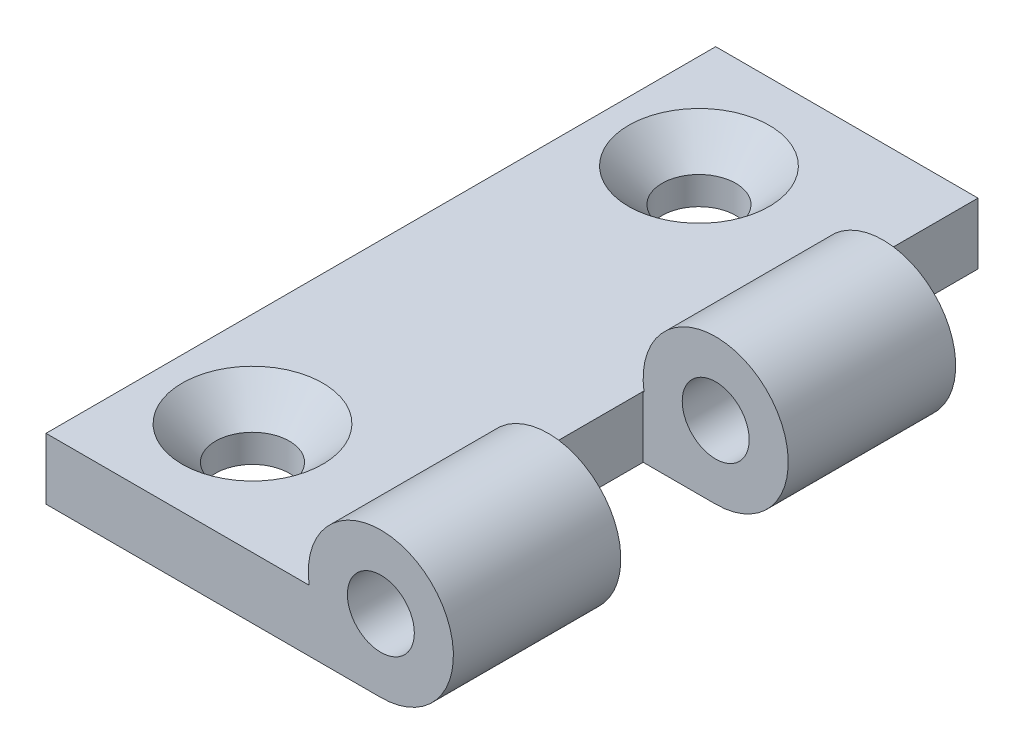
ISO-10303-21;
HEADER;
FILE_DESCRIPTION(('STEP AP214'),'2;1');
FILE_NAME('part.step','',(''),(''),'','','');
FILE_SCHEMA(('AUTOMOTIVE_DESIGN { 1 0 10303 214 1 1 1 1 }'));
ENDSEC;
DATA;
#1=APPLICATION_CONTEXT('core data for automotive mechanical design processes');
#2=APPLICATION_PROTOCOL_DEFINITION('international standard','automotive_design',2000,#1);
#3=PRODUCT_CONTEXT('',#1,'mechanical');
#4=PRODUCT('Part','Part','',(#3));
#5=PRODUCT_RELATED_PRODUCT_CATEGORY('part','',(#4));
#6=PRODUCT_DEFINITION_FORMATION('','',#4);
#7=PRODUCT_DEFINITION_CONTEXT('part definition',#1,'design');
#8=PRODUCT_DEFINITION('design','',#6,#7);
#9=PRODUCT_DEFINITION_SHAPE('','',#8);
#10=(LENGTH_UNIT() NAMED_UNIT(*) SI_UNIT(.MILLI.,.METRE.));
#11=(NAMED_UNIT(*) PLANE_ANGLE_UNIT() SI_UNIT($,.RADIAN.));
#12=(NAMED_UNIT(*) SI_UNIT($,.STERADIAN.) SOLID_ANGLE_UNIT());
#13=UNCERTAINTY_MEASURE_WITH_UNIT(LENGTH_MEASURE(1.E-05),#10,'distance_accuracy_value','');
#14=(GEOMETRIC_REPRESENTATION_CONTEXT(3) GLOBAL_UNCERTAINTY_ASSIGNED_CONTEXT((#13)) GLOBAL_UNIT_ASSIGNED_CONTEXT((#10,
#11,#12)) REPRESENTATION_CONTEXT('',''));
#15=CARTESIAN_POINT('',(0.,0.,0.));
#16=DIRECTION('',(0.,0.,1.));
#17=DIRECTION('',(1.,0.,0.));
#18=AXIS2_PLACEMENT_3D('',#15,#16,#17);
#19=CARTESIAN_POINT('',(0.,-6.5,30.));
#20=DIRECTION('',(0.,-1.,0.));
#21=DIRECTION('',(1.,0.,0.));
#22=AXIS2_PLACEMENT_3D('',#19,#20,#21);
#23=PLANE('',#22);
#24=CARTESIAN_POINT('',(-21.5,-6.5,-20.));
#25=DIRECTION('',(0.,1.,0.));
#26=DIRECTION('',(0.,0.,1.));
#27=AXIS2_PLACEMENT_3D('',#24,#25,#26);
#28=CIRCLE('',#27,3.3);
#29=CARTESIAN_POINT('',(-21.5,-6.5,-16.7));
#30=VERTEX_POINT('',#29);
#31=EDGE_CURVE('E193',#30,#30,#28,.T.);
#32=ORIENTED_EDGE('',*,*,#31,.T.);
#33=EDGE_LOOP('',(#32));
#34=FACE_BOUND('',#33,.T.);
#35=CARTESIAN_POINT('',(-21.5,-6.5,20.));
#36=DIRECTION('',(0.,1.,0.));
#37=DIRECTION('',(0.,0.,1.));
#38=AXIS2_PLACEMENT_3D('',#35,#36,#37);
#39=CIRCLE('',#38,3.3);
#40=CARTESIAN_POINT('',(-21.5,-6.5,23.3));
#41=VERTEX_POINT('',#40);
#42=EDGE_CURVE('E140',#41,#41,#39,.T.);
#43=ORIENTED_EDGE('',*,*,#42,.T.);
#44=EDGE_LOOP('',(#43));
#45=FACE_BOUND('',#44,.T.);
#46=DIRECTION('',(0.,0.,1.));
#47=VECTOR('',#46,1.);
#48=CARTESIAN_POINT('',(-6.5,-6.5,-30.));
#49=LINE('',#48,#47);
#50=CARTESIAN_POINT('',(-6.5,-6.5,-30.));
#51=VERTEX_POINT('',#50);
#52=CARTESIAN_POINT('',(-6.5,-6.5,-15.));
#53=VERTEX_POINT('',#52);
#54=EDGE_CURVE('E111',#51,#53,#49,.T.);
#55=ORIENTED_EDGE('',*,*,#54,.T.);
#56=DIRECTION('',(1.,0.,0.));
#57=VECTOR('',#56,1.);
#58=CARTESIAN_POINT('',(6.5,-6.5,-15.));
#59=LINE('',#58,#57);
#60=CARTESIAN_POINT('',(0.,-6.5,-15.));
#61=VERTEX_POINT('',#60);
#62=EDGE_CURVE('E125',#53,#61,#59,.T.);
#63=ORIENTED_EDGE('',*,*,#62,.T.);
#64=DIRECTION('',(0.,0.,-1.));
#65=VECTOR('',#64,1.);
#66=CARTESIAN_POINT('',(0.,-6.5,30.));
#67=LINE('',#66,#65);
#68=CARTESIAN_POINT('',(0.,-6.5,0.));
#69=VERTEX_POINT('',#68);
#70=EDGE_CURVE('E160',#69,#61,#67,.T.);
#71=ORIENTED_EDGE('',*,*,#70,.F.);
#72=DIRECTION('',(-1.,0.,0.));
#73=VECTOR('',#72,1.);
#74=CARTESIAN_POINT('',(6.5,-6.5,0.));
#75=LINE('',#74,#73);
#76=CARTESIAN_POINT('',(-6.5,-6.5,0.));
#77=VERTEX_POINT('',#76);
#78=EDGE_CURVE('E121',#69,#77,#75,.T.);
#79=ORIENTED_EDGE('',*,*,#78,.T.);
#80=DIRECTION('',(0.,0.,1.));
#81=VECTOR('',#80,1.);
#82=CARTESIAN_POINT('',(-6.5,-6.5,0.));
#83=LINE('',#82,#81);
#84=CARTESIAN_POINT('',(-6.5,-6.5,15.));
#85=VERTEX_POINT('',#84);
#86=EDGE_CURVE('E285',#77,#85,#83,.T.);
#87=ORIENTED_EDGE('',*,*,#86,.T.);
#88=DIRECTION('',(1.,0.,0.));
#89=VECTOR('',#88,1.);
#90=CARTESIAN_POINT('',(6.5,-6.5,15.));
#91=LINE('',#90,#89);
#92=CARTESIAN_POINT('',(0.,-6.5,15.));
#93=VERTEX_POINT('',#92);
#94=EDGE_CURVE('E281',#85,#93,#91,.T.);
#95=ORIENTED_EDGE('',*,*,#94,.T.);
#96=CARTESIAN_POINT('',(0.,-6.5,30.));
#97=VERTEX_POINT('',#96);
#98=EDGE_CURVE('E48',#97,#93,#67,.T.);
#99=ORIENTED_EDGE('',*,*,#98,.F.);
#100=DIRECTION('',(-1.,0.,0.));
#101=VECTOR('',#100,1.);
#102=CARTESIAN_POINT('',(0.,-6.5,30.));
#103=LINE('',#102,#101);
#104=CARTESIAN_POINT('',(-30.,-6.5,30.));
#105=VERTEX_POINT('',#104);
#106=EDGE_CURVE('E149',#97,#105,#103,.T.);
#107=ORIENTED_EDGE('',*,*,#106,.T.);
#108=DIRECTION('',(0.,0.,-1.));
#109=VECTOR('',#108,1.);
#110=CARTESIAN_POINT('',(-30.,-6.5,30.));
#111=LINE('',#110,#109);
#112=CARTESIAN_POINT('',(-30.,-6.5,-30.));
#113=VERTEX_POINT('',#112);
#114=EDGE_CURVE('E135',#105,#113,#111,.T.);
#115=ORIENTED_EDGE('',*,*,#114,.T.);
#116=DIRECTION('',(-1.,0.,0.));
#117=VECTOR('',#116,1.);
#118=CARTESIAN_POINT('',(0.,-6.5,-30.));
#119=LINE('',#118,#117);
#120=EDGE_CURVE('E129',#51,#113,#119,.T.);
#121=ORIENTED_EDGE('',*,*,#120,.F.);
#122=EDGE_LOOP('',(#55,#63,#71,#79,#87,#95,#99,#107,#115,#121));
#123=FACE_BOUND('',#122,.T.);
#124=ADVANCED_FACE('F41',(#34,#45,#123),#23,.T.);
#125=CARTESIAN_POINT('',(0.,0.,30.));
#126=DIRECTION('',(0.,0.,-1.));
#127=DIRECTION('',(-1.,0.,0.));
#128=AXIS2_PLACEMENT_3D('',#125,#126,#127);
#129=CYLINDRICAL_SURFACE('',#128,6.5);
#130=CARTESIAN_POINT('',(0.,0.,15.));
#131=DIRECTION('',(0.,0.,1.));
#132=DIRECTION('',(1.,0.,0.));
#133=AXIS2_PLACEMENT_3D('',#130,#131,#132);
#134=CIRCLE('',#133,6.5);
#135=CARTESIAN_POINT('',(-6.42261628933256,-1.,15.));
#136=VERTEX_POINT('',#135);
#137=EDGE_CURVE('E171',#93,#136,#134,.T.);
#138=ORIENTED_EDGE('',*,*,#137,.T.);
#139=DIRECTION('',(0.,0.,-1.));
#140=VECTOR('',#139,1.);
#141=CARTESIAN_POINT('',(-6.42261628933256,-1.,30.));
#142=LINE('',#141,#140);
#143=CARTESIAN_POINT('',(-6.42261628933256,-1.,30.));
#144=VERTEX_POINT('',#143);
#145=EDGE_CURVE('E152',#144,#136,#142,.T.);
#146=ORIENTED_EDGE('',*,*,#145,.F.);
#147=CARTESIAN_POINT('',(0.,0.,30.));
#148=DIRECTION('',(0.,0.,1.));
#149=DIRECTION('',(1.,0.,0.));
#150=AXIS2_PLACEMENT_3D('',#147,#148,#149);
#151=CIRCLE('',#150,6.5);
#152=EDGE_CURVE('E199',#97,#144,#151,.T.);
#153=ORIENTED_EDGE('',*,*,#152,.F.);
#154=ORIENTED_EDGE('',*,*,#98,.T.);
#155=EDGE_LOOP('',(#138,#146,#153,#154));
#156=FACE_BOUND('',#155,.T.);
#157=ADVANCED_FACE('F233',(#156),#129,.T.);
#158=CARTESIAN_POINT('',(0.,0.,30.));
#159=DIRECTION('',(0.,0.,-1.));
#160=DIRECTION('',(-1.,0.,0.));
#161=AXIS2_PLACEMENT_3D('',#158,#159,#160);
#162=CYLINDRICAL_SURFACE('',#161,3.);
#163=CARTESIAN_POINT('',(0.,0.,15.));
#164=DIRECTION('',(0.,0.,1.));
#165=DIRECTION('',(1.,0.,0.));
#166=AXIS2_PLACEMENT_3D('',#163,#164,#165);
#167=CIRCLE('',#166,3.);
#168=CARTESIAN_POINT('',(3.,0.,15.));
#169=VERTEX_POINT('',#168);
#170=EDGE_CURVE('E164',#169,#169,#167,.T.);
#171=ORIENTED_EDGE('',*,*,#170,.F.);
#172=EDGE_LOOP('',(#171));
#173=FACE_BOUND('',#172,.T.);
#174=CARTESIAN_POINT('',(0.,0.,30.));
#175=DIRECTION('',(0.,0.,1.));
#176=DIRECTION('',(1.,0.,0.));
#177=AXIS2_PLACEMENT_3D('',#174,#175,#176);
#178=CIRCLE('',#177,3.);
#179=CARTESIAN_POINT('',(3.,0.,30.));
#180=VERTEX_POINT('',#179);
#181=EDGE_CURVE('E144',#180,#180,#178,.T.);
#182=ORIENTED_EDGE('',*,*,#181,.T.);
#183=EDGE_LOOP('',(#182));
#184=FACE_BOUND('',#183,.T.);
#185=ADVANCED_FACE('F211',(#173,#184),#162,.F.);
#186=CARTESIAN_POINT('',(0.,0.,-30.));
#187=DIRECTION('',(0.,0.,1.));
#188=DIRECTION('',(1.,0.,0.));
#189=AXIS2_PLACEMENT_3D('',#186,#187,#188);
#190=PLANE('',#189);
#191=DIRECTION('',(0.,1.,0.));
#192=VECTOR('',#191,1.);
#193=CARTESIAN_POINT('',(-6.5,-6.5,-30.));
#194=LINE('',#193,#192);
#195=CARTESIAN_POINT('',(-6.5,-1.,-30.));
#196=VERTEX_POINT('',#195);
#197=EDGE_CURVE('E64',#51,#196,#194,.T.);
#198=ORIENTED_EDGE('',*,*,#197,.F.);
#199=ORIENTED_EDGE('',*,*,#120,.T.);
#200=DIRECTION('',(0.,1.,0.));
#201=VECTOR('',#200,1.);
#202=CARTESIAN_POINT('',(-30.,0.,-30.));
#203=LINE('',#202,#201);
#204=CARTESIAN_POINT('',(-30.,-1.,-30.));
#205=VERTEX_POINT('',#204);
#206=EDGE_CURVE('E137',#113,#205,#203,.T.);
#207=ORIENTED_EDGE('',*,*,#206,.T.);
#208=DIRECTION('',(1.,0.,0.));
#209=VECTOR('',#208,1.);
#210=CARTESIAN_POINT('',(0.,-1.,-30.));
#211=LINE('',#210,#209);
#212=EDGE_CURVE('E132',#205,#196,#211,.T.);
#213=ORIENTED_EDGE('',*,*,#212,.T.);
#214=EDGE_LOOP('',(#198,#199,#207,#213));
#215=FACE_BOUND('',#214,.T.);
#216=ADVANCED_FACE('F130',(#215),#190,.F.);
#217=CARTESIAN_POINT('',(0.,0.,-15.));
#218=DIRECTION('',(0.,0.,1.));
#219=DIRECTION('',(1.,0.,0.));
#220=AXIS2_PLACEMENT_3D('',#217,#218,#219);
#221=CIRCLE('',#220,6.5);
#222=CARTESIAN_POINT('',(-6.42261628933256,-1.,-15.));
#223=VERTEX_POINT('',#222);
#224=EDGE_CURVE('E175',#61,#223,#221,.T.);
#225=ORIENTED_EDGE('',*,*,#224,.T.);
#226=CARTESIAN_POINT('',(-6.42261628933256,-1.,0.));
#227=VERTEX_POINT('',#226);
#228=EDGE_CURVE('E153',#227,#223,#142,.T.);
#229=ORIENTED_EDGE('',*,*,#228,.F.);
#230=CARTESIAN_POINT('',(0.,0.,0.));
#231=DIRECTION('',(0.,0.,-1.));
#232=DIRECTION('',(-1.,0.,0.));
#233=AXIS2_PLACEMENT_3D('',#230,#231,#232);
#234=CIRCLE('',#233,6.5);
#235=EDGE_CURVE('E54',#227,#69,#234,.T.);
#236=ORIENTED_EDGE('',*,*,#235,.T.);
#237=ORIENTED_EDGE('',*,*,#70,.T.);
#238=EDGE_LOOP('',(#225,#229,#236,#237));
#239=FACE_BOUND('',#238,.T.);
#240=ADVANCED_FACE('F240',(#239),#129,.T.);
#241=CARTESIAN_POINT('',(0.,-1.,30.));
#242=DIRECTION('',(0.,1.,0.));
#243=DIRECTION('',(0.,0.,1.));
#244=AXIS2_PLACEMENT_3D('',#241,#242,#243);
#245=PLANE('',#244);
#246=DIRECTION('',(1.,0.,0.));
#247=VECTOR('',#246,1.);
#248=CARTESIAN_POINT('',(0.,-1.,-15.));
#249=LINE('',#248,#247);
#250=CARTESIAN_POINT('',(-6.5,-1.,-15.));
#251=VERTEX_POINT('',#250);
#252=EDGE_CURVE('E168',#251,#223,#249,.T.);
#253=ORIENTED_EDGE('',*,*,#252,.F.);
#254=DIRECTION('',(0.,0.,1.));
#255=VECTOR('',#254,1.);
#256=CARTESIAN_POINT('',(-6.5,-1.,30.));
#257=LINE('',#256,#255);
#258=EDGE_CURVE('E163',#196,#251,#257,.T.);
#259=ORIENTED_EDGE('',*,*,#258,.F.);
#260=ORIENTED_EDGE('',*,*,#212,.F.);
#261=DIRECTION('',(0.,0.,-1.));
#262=VECTOR('',#261,1.);
#263=CARTESIAN_POINT('',(-30.,-1.,30.));
#264=LINE('',#263,#262);
#265=CARTESIAN_POINT('',(-30.,-1.,30.));
#266=VERTEX_POINT('',#265);
#267=EDGE_CURVE('E151',#266,#205,#264,.T.);
#268=ORIENTED_EDGE('',*,*,#267,.F.);
#269=DIRECTION('',(1.,0.,0.));
#270=VECTOR('',#269,1.);
#271=CARTESIAN_POINT('',(0.,-1.,30.));
#272=LINE('',#271,#270);
#273=EDGE_CURVE('E205',#266,#144,#272,.T.);
#274=ORIENTED_EDGE('',*,*,#273,.T.);
#275=ORIENTED_EDGE('',*,*,#145,.T.);
#276=DIRECTION('',(1.,0.,0.));
#277=VECTOR('',#276,1.);
#278=CARTESIAN_POINT('',(0.,-1.,15.));
#279=LINE('',#278,#277);
#280=CARTESIAN_POINT('',(-6.5,-1.,15.));
#281=VERTEX_POINT('',#280);
#282=EDGE_CURVE('E170',#281,#136,#279,.T.);
#283=ORIENTED_EDGE('',*,*,#282,.F.);
#284=DIRECTION('',(0.,0.,1.));
#285=VECTOR('',#284,1.);
#286=CARTESIAN_POINT('',(-6.5,-1.,30.));
#287=LINE('',#286,#285);
#288=CARTESIAN_POINT('',(-6.5,-1.,0.));
#289=VERTEX_POINT('',#288);
#290=EDGE_CURVE('E11',#289,#281,#287,.T.);
#291=ORIENTED_EDGE('',*,*,#290,.F.);
#292=DIRECTION('',(-1.,0.,0.));
#293=VECTOR('',#292,1.);
#294=CARTESIAN_POINT('',(0.,-1.,0.));
#295=LINE('',#294,#293);
#296=EDGE_CURVE('E162',#227,#289,#295,.T.);
#297=ORIENTED_EDGE('',*,*,#296,.F.);
#298=ORIENTED_EDGE('',*,*,#228,.T.);
#299=EDGE_LOOP('',(#253,#259,#260,#268,#274,#275,#283,#291,#297,#298));
#300=FACE_BOUND('',#299,.T.);
#301=CARTESIAN_POINT('',(-21.5,-1.,-20.));
#302=DIRECTION('',(0.,1.,0.));
#303=DIRECTION('',(0.,0.,1.));
#304=AXIS2_PLACEMENT_3D('',#301,#302,#303);
#305=CIRCLE('',#304,6.3);
#306=CARTESIAN_POINT('',(-21.5,-1.,-13.7));
#307=VERTEX_POINT('',#306);
#308=EDGE_CURVE('E183',#307,#307,#305,.T.);
#309=ORIENTED_EDGE('',*,*,#308,.F.);
#310=EDGE_LOOP('',(#309));
#311=FACE_BOUND('',#310,.T.);
#312=CARTESIAN_POINT('',(-21.5,-1.,20.));
#313=DIRECTION('',(0.,1.,0.));
#314=DIRECTION('',(0.,0.,1.));
#315=AXIS2_PLACEMENT_3D('',#312,#313,#314);
#316=CIRCLE('',#315,6.3);
#317=CARTESIAN_POINT('',(-21.5,-1.,26.3));
#318=VERTEX_POINT('',#317);
#319=EDGE_CURVE('E192',#318,#318,#316,.T.);
#320=ORIENTED_EDGE('',*,*,#319,.F.);
#321=EDGE_LOOP('',(#320));
#322=FACE_BOUND('',#321,.T.);
#323=ADVANCED_FACE('F226',(#300,#311,#322),#245,.T.);
#324=CARTESIAN_POINT('',(-30.,0.,30.));
#325=DIRECTION('',(-1.,0.,0.));
#326=DIRECTION('',(0.,0.,1.));
#327=AXIS2_PLACEMENT_3D('',#324,#325,#326);
#328=PLANE('',#327);
#329=ORIENTED_EDGE('',*,*,#206,.F.);
#330=ORIENTED_EDGE('',*,*,#114,.F.);
#331=DIRECTION('',(0.,1.,0.));
#332=VECTOR('',#331,1.);
#333=CARTESIAN_POINT('',(-30.,0.,30.));
#334=LINE('',#333,#332);
#335=EDGE_CURVE('E204',#105,#266,#334,.T.);
#336=ORIENTED_EDGE('',*,*,#335,.T.);
#337=ORIENTED_EDGE('',*,*,#267,.T.);
#338=EDGE_LOOP('',(#329,#330,#336,#337));
#339=FACE_BOUND('',#338,.T.);
#340=ADVANCED_FACE('F216',(#339),#328,.T.);
#341=CARTESIAN_POINT('',(0.,0.,30.));
#342=DIRECTION('',(0.,0.,1.));
#343=DIRECTION('',(1.,0.,0.));
#344=AXIS2_PLACEMENT_3D('',#341,#342,#343);
#345=PLANE('',#344);
#346=ORIENTED_EDGE('',*,*,#106,.F.);
#347=ORIENTED_EDGE('',*,*,#152,.T.);
#348=ORIENTED_EDGE('',*,*,#273,.F.);
#349=ORIENTED_EDGE('',*,*,#335,.F.);
#350=EDGE_LOOP('',(#346,#347,#348,#349));
#351=FACE_BOUND('',#350,.T.);
#352=ORIENTED_EDGE('',*,*,#181,.F.);
#353=EDGE_LOOP('',(#352));
#354=FACE_BOUND('',#353,.T.);
#355=ADVANCED_FACE('F213',(#351,#354),#345,.T.);
#356=CARTESIAN_POINT('',(-21.5,-1.,20.));
#357=DIRECTION('',(0.,1.,0.));
#358=DIRECTION('',(0.,0.,1.));
#359=AXIS2_PLACEMENT_3D('',#356,#357,#358);
#360=CYLINDRICAL_SURFACE('',#359,3.3);
#361=ORIENTED_EDGE('',*,*,#42,.F.);
#362=EDGE_LOOP('',(#361));
#363=FACE_BOUND('',#362,.T.);
#364=CARTESIAN_POINT('',(-21.5,-4.,20.));
#365=DIRECTION('',(0.,1.,0.));
#366=DIRECTION('',(0.,0.,1.));
#367=AXIS2_PLACEMENT_3D('',#364,#365,#366);
#368=CIRCLE('',#367,3.3);
#369=CARTESIAN_POINT('',(-21.5,-4.,23.3));
#370=VERTEX_POINT('',#369);
#371=EDGE_CURVE('E142',#370,#370,#368,.T.);
#372=ORIENTED_EDGE('',*,*,#371,.T.);
#373=EDGE_LOOP('',(#372));
#374=FACE_BOUND('',#373,.T.);
#375=ADVANCED_FACE('F214',(#363,#374),#360,.F.);
#376=CARTESIAN_POINT('',(-21.5,-1.,20.));
#377=DIRECTION('',(0.,1.,0.));
#378=DIRECTION('',(0.,0.,1.));
#379=AXIS2_PLACEMENT_3D('',#376,#377,#378);
#380=CONICAL_SURFACE('',#379,6.3,0.785398163397448);
#381=ORIENTED_EDGE('',*,*,#371,.F.);
#382=EDGE_LOOP('',(#381));
#383=FACE_BOUND('',#382,.T.);
#384=ORIENTED_EDGE('',*,*,#319,.T.);
#385=EDGE_LOOP('',(#384));
#386=FACE_BOUND('',#385,.T.);
#387=ADVANCED_FACE('F224',(#383,#386),#380,.F.);
#388=CARTESIAN_POINT('',(-21.5,-1.,-20.));
#389=DIRECTION('',(0.,1.,0.));
#390=DIRECTION('',(0.,0.,1.));
#391=AXIS2_PLACEMENT_3D('',#388,#389,#390);
#392=CYLINDRICAL_SURFACE('',#391,3.3);
#393=ORIENTED_EDGE('',*,*,#31,.F.);
#394=EDGE_LOOP('',(#393));
#395=FACE_BOUND('',#394,.T.);
#396=CARTESIAN_POINT('',(-21.5,-4.,-20.));
#397=DIRECTION('',(0.,1.,0.));
#398=DIRECTION('',(0.,0.,1.));
#399=AXIS2_PLACEMENT_3D('',#396,#397,#398);
#400=CIRCLE('',#399,3.3);
#401=CARTESIAN_POINT('',(-21.5,-4.,-16.7));
#402=VERTEX_POINT('',#401);
#403=EDGE_CURVE('E189',#402,#402,#400,.T.);
#404=ORIENTED_EDGE('',*,*,#403,.T.);
#405=EDGE_LOOP('',(#404));
#406=FACE_BOUND('',#405,.T.);
#407=ADVANCED_FACE('F248',(#395,#406),#392,.F.);
#408=CARTESIAN_POINT('',(-21.5,-1.,-20.));
#409=DIRECTION('',(0.,1.,0.));
#410=DIRECTION('',(0.,0.,1.));
#411=AXIS2_PLACEMENT_3D('',#408,#409,#410);
#412=CONICAL_SURFACE('',#411,6.3,0.785398163397448);
#413=ORIENTED_EDGE('',*,*,#403,.F.);
#414=EDGE_LOOP('',(#413));
#415=FACE_BOUND('',#414,.T.);
#416=ORIENTED_EDGE('',*,*,#308,.T.);
#417=EDGE_LOOP('',(#416));
#418=FACE_BOUND('',#417,.T.);
#419=ADVANCED_FACE('F277',(#415,#418),#412,.F.);
#420=CARTESIAN_POINT('',(6.5,-6.5,15.));
#421=DIRECTION('',(0.,0.,1.));
#422=DIRECTION('',(1.,0.,0.));
#423=AXIS2_PLACEMENT_3D('',#420,#421,#422);
#424=PLANE('',#423);
#425=ORIENTED_EDGE('',*,*,#170,.T.);
#426=EDGE_LOOP('',(#425));
#427=FACE_BOUND('',#426,.T.);
#428=ORIENTED_EDGE('',*,*,#94,.F.);
#429=DIRECTION('',(0.,1.,0.));
#430=VECTOR('',#429,1.);
#431=CARTESIAN_POINT('',(-6.5,-6.5,15.));
#432=LINE('',#431,#430);
#433=EDGE_CURVE('E284',#85,#281,#432,.T.);
#434=ORIENTED_EDGE('',*,*,#433,.T.);
#435=ORIENTED_EDGE('',*,*,#282,.T.);
#436=ORIENTED_EDGE('',*,*,#137,.F.);
#437=EDGE_LOOP('',(#428,#434,#435,#436));
#438=FACE_BOUND('',#437,.T.);
#439=ADVANCED_FACE('F272',(#427,#438),#424,.F.);
#440=CARTESIAN_POINT('',(6.5,-6.5,0.));
#441=DIRECTION('',(0.,0.,-1.));
#442=DIRECTION('',(-1.,0.,0.));
#443=AXIS2_PLACEMENT_3D('',#440,#441,#442);
#444=PLANE('',#443);
#445=CARTESIAN_POINT('',(0.,0.,0.));
#446=DIRECTION('',(0.,0.,-1.));
#447=DIRECTION('',(-1.,0.,0.));
#448=AXIS2_PLACEMENT_3D('',#445,#446,#447);
#449=CIRCLE('',#448,3.);
#450=CARTESIAN_POINT('',(-3.,0.,0.));
#451=VERTEX_POINT('',#450);
#452=EDGE_CURVE('E159',#451,#451,#449,.T.);
#453=ORIENTED_EDGE('',*,*,#452,.T.);
#454=EDGE_LOOP('',(#453));
#455=FACE_BOUND('',#454,.T.);
#456=ORIENTED_EDGE('',*,*,#235,.F.);
#457=ORIENTED_EDGE('',*,*,#296,.T.);
#458=DIRECTION('',(0.,1.,0.));
#459=VECTOR('',#458,1.);
#460=CARTESIAN_POINT('',(-6.5,-6.5,0.));
#461=LINE('',#460,#459);
#462=EDGE_CURVE('E288',#77,#289,#461,.T.);
#463=ORIENTED_EDGE('',*,*,#462,.F.);
#464=ORIENTED_EDGE('',*,*,#78,.F.);
#465=EDGE_LOOP('',(#456,#457,#463,#464));
#466=FACE_BOUND('',#465,.T.);
#467=ADVANCED_FACE('F274',(#455,#466),#444,.F.);
#468=CARTESIAN_POINT('',(-6.5,-6.5,0.));
#469=DIRECTION('',(-1.,0.,0.));
#470=DIRECTION('',(0.,0.,1.));
#471=AXIS2_PLACEMENT_3D('',#468,#469,#470);
#472=PLANE('',#471);
#473=ORIENTED_EDGE('',*,*,#290,.T.);
#474=ORIENTED_EDGE('',*,*,#433,.F.);
#475=ORIENTED_EDGE('',*,*,#86,.F.);
#476=ORIENTED_EDGE('',*,*,#462,.T.);
#477=EDGE_LOOP('',(#473,#474,#475,#476));
#478=FACE_BOUND('',#477,.T.);
#479=ADVANCED_FACE('F308',(#478),#472,.F.);
#480=CARTESIAN_POINT('',(6.5,-6.5,-15.));
#481=DIRECTION('',(0.,0.,1.));
#482=DIRECTION('',(1.,0.,0.));
#483=AXIS2_PLACEMENT_3D('',#480,#481,#482);
#484=PLANE('',#483);
#485=CARTESIAN_POINT('',(0.,0.,-15.));
#486=DIRECTION('',(0.,0.,1.));
#487=DIRECTION('',(1.,0.,0.));
#488=AXIS2_PLACEMENT_3D('',#485,#486,#487);
#489=CIRCLE('',#488,3.);
#490=CARTESIAN_POINT('',(3.,0.,-15.));
#491=VERTEX_POINT('',#490);
#492=EDGE_CURVE('E169',#491,#491,#489,.T.);
#493=ORIENTED_EDGE('',*,*,#492,.T.);
#494=EDGE_LOOP('',(#493));
#495=FACE_BOUND('',#494,.T.);
#496=ORIENTED_EDGE('',*,*,#62,.F.);
#497=DIRECTION('',(0.,1.,0.));
#498=VECTOR('',#497,1.);
#499=CARTESIAN_POINT('',(-6.5,-6.5,-15.));
#500=LINE('',#499,#498);
#501=EDGE_CURVE('E117',#53,#251,#500,.T.);
#502=ORIENTED_EDGE('',*,*,#501,.T.);
#503=ORIENTED_EDGE('',*,*,#252,.T.);
#504=ORIENTED_EDGE('',*,*,#224,.F.);
#505=EDGE_LOOP('',(#496,#502,#503,#504));
#506=FACE_BOUND('',#505,.T.);
#507=ADVANCED_FACE('F310',(#495,#506),#484,.F.);
#508=CARTESIAN_POINT('',(-6.5,-6.5,-30.));
#509=DIRECTION('',(-1.,0.,0.));
#510=DIRECTION('',(0.,0.,1.));
#511=AXIS2_PLACEMENT_3D('',#508,#509,#510);
#512=PLANE('',#511);
#513=ORIENTED_EDGE('',*,*,#258,.T.);
#514=ORIENTED_EDGE('',*,*,#501,.F.);
#515=ORIENTED_EDGE('',*,*,#54,.F.);
#516=ORIENTED_EDGE('',*,*,#197,.T.);
#517=EDGE_LOOP('',(#513,#514,#515,#516));
#518=FACE_BOUND('',#517,.T.);
#519=ADVANCED_FACE('F113',(#518),#512,.F.);
#520=ORIENTED_EDGE('',*,*,#492,.F.);
#521=EDGE_LOOP('',(#520));
#522=FACE_BOUND('',#521,.T.);
#523=ORIENTED_EDGE('',*,*,#452,.F.);
#524=EDGE_LOOP('',(#523));
#525=FACE_BOUND('',#524,.T.);
#526=ADVANCED_FACE('F261',(#522,#525),#162,.F.);
#527=CLOSED_SHELL('',(#124,#157,#185,#216,#240,#323,#340,#355,#375,#387,#407,#419,#439,#467,
#479,#507,#519,#526));
#528=MANIFOLD_SOLID_BREP('B2',#527);
#529=ADVANCED_BREP_SHAPE_REPRESENTATION('',(#18,#528),#14);
#530=SHAPE_DEFINITION_REPRESENTATION(#9,#529);
ENDSEC;
END-ISO-10303-21;
